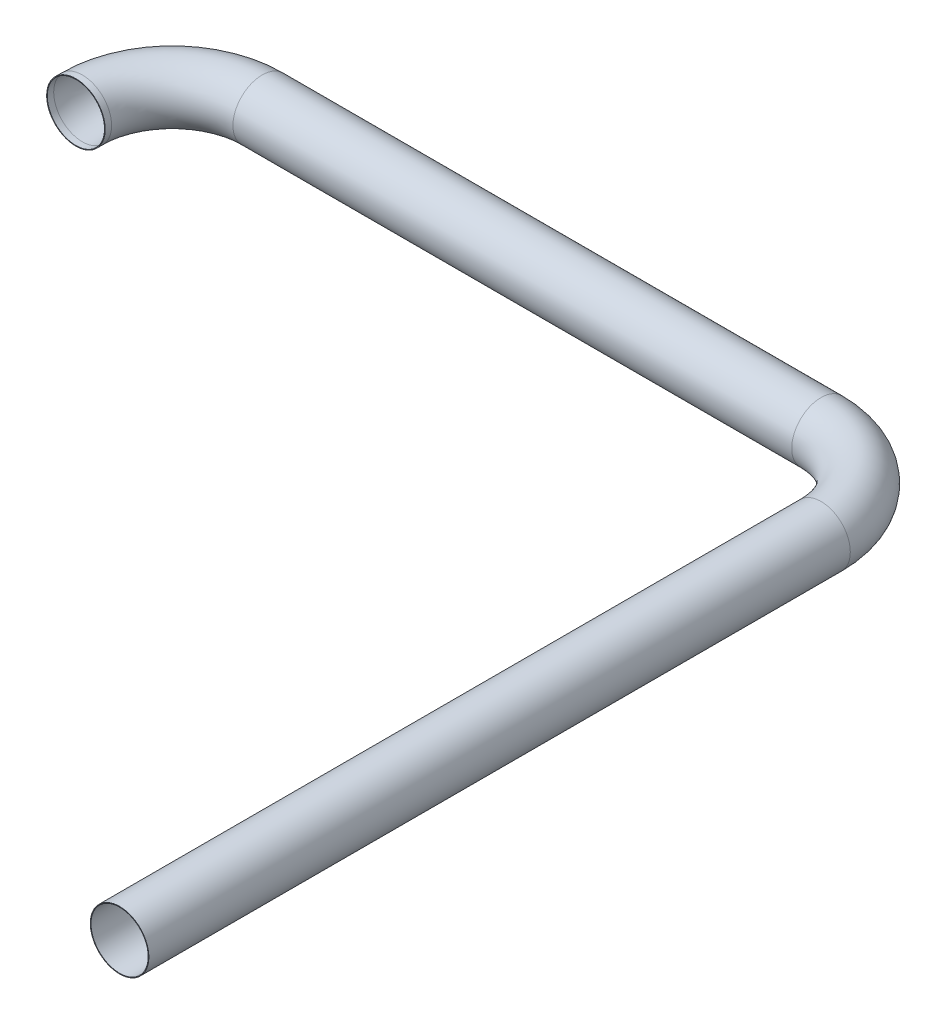
ISO-10303-21;
HEADER;
FILE_DESCRIPTION(('STEP AP214'),'2;1');
FILE_NAME('part.step','',(''),(''),'','','');
FILE_SCHEMA(('AUTOMOTIVE_DESIGN { 1 0 10303 214 1 1 1 1 }'));
ENDSEC;
DATA;
#1=APPLICATION_CONTEXT('core data for automotive mechanical design processes');
#2=APPLICATION_PROTOCOL_DEFINITION('international standard','automotive_design',2000,#1);
#3=PRODUCT_CONTEXT('',#1,'mechanical');
#4=PRODUCT('Part','Part','',(#3));
#5=PRODUCT_RELATED_PRODUCT_CATEGORY('part','',(#4));
#6=PRODUCT_DEFINITION_FORMATION('','',#4);
#7=PRODUCT_DEFINITION_CONTEXT('part definition',#1,'design');
#8=PRODUCT_DEFINITION('design','',#6,#7);
#9=PRODUCT_DEFINITION_SHAPE('','',#8);
#10=(LENGTH_UNIT() NAMED_UNIT(*) SI_UNIT(.MILLI.,.METRE.));
#11=(NAMED_UNIT(*) PLANE_ANGLE_UNIT() SI_UNIT($,.RADIAN.));
#12=(NAMED_UNIT(*) SI_UNIT($,.STERADIAN.) SOLID_ANGLE_UNIT());
#13=UNCERTAINTY_MEASURE_WITH_UNIT(LENGTH_MEASURE(1.E-05),#10,'distance_accuracy_value','');
#14=(GEOMETRIC_REPRESENTATION_CONTEXT(3) GLOBAL_UNCERTAINTY_ASSIGNED_CONTEXT((#13)) GLOBAL_UNIT_ASSIGNED_CONTEXT((#10,
#11,#12)) REPRESENTATION_CONTEXT('',''));
#15=CARTESIAN_POINT('',(0.,0.,0.));
#16=DIRECTION('',(0.,0.,1.));
#17=DIRECTION('',(1.,0.,0.));
#18=AXIS2_PLACEMENT_3D('',#15,#16,#17);
#19=CARTESIAN_POINT('',(0.,0.,0.));
#20=DIRECTION('',(0.,0.,-1.));
#21=DIRECTION('',(-1.,0.,0.));
#22=AXIS2_PLACEMENT_3D('',#19,#20,#21);
#23=CYLINDRICAL_SURFACE('',#22,45.59);
#24=CARTESIAN_POINT('',(0.,0.,-1092.));
#25=DIRECTION('',(0.,0.,1.));
#26=DIRECTION('',(1.,0.,0.));
#27=AXIS2_PLACEMENT_3D('',#24,#25,#26);
#28=CIRCLE('',#27,45.59);
#29=CARTESIAN_POINT('',(45.59,0.,-1092.));
#30=VERTEX_POINT('',#29);
#31=EDGE_CURVE('E124',#30,#30,#28,.T.);
#32=ORIENTED_EDGE('',*,*,#31,.T.);
#33=EDGE_LOOP('',(#32));
#34=FACE_BOUND('',#33,.T.);
#35=CARTESIAN_POINT('',(0.,0.,0.));
#36=DIRECTION('',(0.,0.,1.));
#37=DIRECTION('',(1.,0.,0.));
#38=AXIS2_PLACEMENT_3D('',#35,#36,#37);
#39=CIRCLE('',#38,45.59);
#40=CARTESIAN_POINT('',(45.59,0.,0.));
#41=VERTEX_POINT('',#40);
#42=EDGE_CURVE('E58',#41,#41,#39,.T.);
#43=ORIENTED_EDGE('',*,*,#42,.F.);
#44=EDGE_LOOP('',(#43));
#45=FACE_BOUND('',#44,.T.);
#46=ADVANCED_FACE('F43',(#34,#45),#23,.T.);
#47=CARTESIAN_POINT('',(-140.,0.,-1092.));
#48=DIRECTION('',(0.,1.,0.));
#49=DIRECTION('',(0.,0.,1.));
#50=AXIS2_PLACEMENT_3D('',#47,#48,#49);
#51=TOROIDAL_SURFACE('',#50,140.,45.59);
#52=CARTESIAN_POINT('',(-140.000000000001,0.,-1232.));
#53=DIRECTION('',(1.,0.,0.));
#54=DIRECTION('',(0.,0.,-1.));
#55=AXIS2_PLACEMENT_3D('',#52,#53,#54);
#56=CIRCLE('',#55,45.59);
#57=CARTESIAN_POINT('',(-140.000000000001,0.,-1277.59));
#58=VERTEX_POINT('',#57);
#59=EDGE_CURVE('E127',#58,#58,#56,.T.);
#60=CARTESIAN_POINT('',(-140.,0.,-1092.));
#61=DIRECTION('',(0.,1.,0.));
#62=DIRECTION('',(0.,0.,1.));
#63=AXIS2_PLACEMENT_3D('',#60,#61,#62);
#64=CIRCLE('',#63,185.59);
#65=EDGE_CURVE('',#30,#58,#64,.T.);
#66=ORIENTED_EDGE('',*,*,#31,.F.);
#67=ORIENTED_EDGE('',*,*,#59,.T.);
#68=ORIENTED_EDGE('',*,*,#65,.T.);
#69=ORIENTED_EDGE('',*,*,#65,.F.);
#70=EDGE_LOOP('',(#66,#68,#67,#69));
#71=FACE_BOUND('',#70,.T.);
#72=ADVANCED_FACE('F148',(#71),#51,.T.);
#73=CARTESIAN_POINT('',(-140.000000000001,0.,-1232.));
#74=DIRECTION('',(-1.,0.,0.));
#75=DIRECTION('',(0.,0.,1.));
#76=AXIS2_PLACEMENT_3D('',#73,#74,#75);
#77=CYLINDRICAL_SURFACE('',#76,45.59);
#78=CARTESIAN_POINT('',(-1010.,0.,-1232.));
#79=DIRECTION('',(1.,0.,0.));
#80=DIRECTION('',(0.,0.,-1.));
#81=AXIS2_PLACEMENT_3D('',#78,#79,#80);
#82=CIRCLE('',#81,45.59);
#83=CARTESIAN_POINT('',(-1010.,0.,-1277.59));
#84=VERTEX_POINT('',#83);
#85=EDGE_CURVE('E129',#84,#84,#82,.T.);
#86=ORIENTED_EDGE('',*,*,#85,.T.);
#87=EDGE_LOOP('',(#86));
#88=FACE_BOUND('',#87,.T.);
#89=ORIENTED_EDGE('',*,*,#59,.F.);
#90=EDGE_LOOP('',(#89));
#91=FACE_BOUND('',#90,.T.);
#92=ADVANCED_FACE('F144',(#88,#91),#77,.T.);
#93=CARTESIAN_POINT('',(-1010.,0.,-1092.));
#94=DIRECTION('',(0.,1.,0.));
#95=DIRECTION('',(0.,0.,1.));
#96=AXIS2_PLACEMENT_3D('',#93,#94,#95);
#97=TOROIDAL_SURFACE('',#96,140.,45.59);
#98=CARTESIAN_POINT('',(-1150.,0.,-1092.));
#99=DIRECTION('',(0.,0.,-1.));
#100=DIRECTION('',(-1.,0.,0.));
#101=AXIS2_PLACEMENT_3D('',#98,#99,#100);
#102=CIRCLE('',#101,45.59);
#103=CARTESIAN_POINT('',(-1195.59,0.,-1092.));
#104=VERTEX_POINT('',#103);
#105=EDGE_CURVE('E47',#104,#104,#102,.T.);
#106=CARTESIAN_POINT('',(-1010.,0.,-1092.));
#107=DIRECTION('',(0.,1.,0.));
#108=DIRECTION('',(0.,0.,1.));
#109=AXIS2_PLACEMENT_3D('',#106,#107,#108);
#110=CIRCLE('',#109,185.59);
#111=EDGE_CURVE('',#84,#104,#110,.T.);
#112=ORIENTED_EDGE('',*,*,#85,.F.);
#113=ORIENTED_EDGE('',*,*,#105,.T.);
#114=ORIENTED_EDGE('',*,*,#111,.T.);
#115=ORIENTED_EDGE('',*,*,#111,.F.);
#116=EDGE_LOOP('',(#112,#114,#113,#115));
#117=FACE_BOUND('',#116,.T.);
#118=ADVANCED_FACE('F136',(#117),#97,.T.);
#119=CARTESIAN_POINT('',(-1150.,0.,-1092.));
#120=DIRECTION('',(0.,0.,1.));
#121=DIRECTION('',(1.,0.,0.));
#122=AXIS2_PLACEMENT_3D('',#119,#120,#121);
#123=CYLINDRICAL_SURFACE('',#122,45.59);
#124=CARTESIAN_POINT('',(-1150.,0.,-1082.));
#125=DIRECTION('',(0.,0.,-1.));
#126=DIRECTION('',(-1.,0.,0.));
#127=AXIS2_PLACEMENT_3D('',#124,#125,#126);
#128=CIRCLE('',#127,45.59);
#129=CARTESIAN_POINT('',(-1195.59,0.,-1082.));
#130=VERTEX_POINT('',#129);
#131=EDGE_CURVE('E63',#130,#130,#128,.T.);
#132=ORIENTED_EDGE('',*,*,#131,.T.);
#133=EDGE_LOOP('',(#132));
#134=FACE_BOUND('',#133,.T.);
#135=ORIENTED_EDGE('',*,*,#105,.F.);
#136=EDGE_LOOP('',(#135));
#137=FACE_BOUND('',#136,.T.);
#138=ADVANCED_FACE('F45',(#134,#137),#123,.T.);
#139=CARTESIAN_POINT('',(0.,0.,0.));
#140=DIRECTION('',(0.,0.,1.));
#141=DIRECTION('',(1.,0.,0.));
#142=AXIS2_PLACEMENT_3D('',#139,#140,#141);
#143=PLANE('',#142);
#144=CARTESIAN_POINT('',(0.,0.,0.));
#145=DIRECTION('',(0.,0.,1.));
#146=DIRECTION('',(1.,0.,0.));
#147=AXIS2_PLACEMENT_3D('',#144,#145,#146);
#148=CIRCLE('',#147,44.59);
#149=CARTESIAN_POINT('',(44.59,0.,0.));
#150=VERTEX_POINT('',#149);
#151=EDGE_CURVE('E111',#150,#150,#148,.F.);
#152=ORIENTED_EDGE('',*,*,#151,.T.);
#153=EDGE_LOOP('',(#152));
#154=FACE_BOUND('',#153,.T.);
#155=ORIENTED_EDGE('',*,*,#42,.T.);
#156=EDGE_LOOP('',(#155));
#157=FACE_BOUND('',#156,.T.);
#158=ADVANCED_FACE('F76',(#154,#157),#143,.T.);
#159=CARTESIAN_POINT('',(-1150.,0.,-1082.));
#160=DIRECTION('',(0.,0.,-1.));
#161=DIRECTION('',(-1.,0.,0.));
#162=AXIS2_PLACEMENT_3D('',#159,#160,#161);
#163=PLANE('',#162);
#164=CARTESIAN_POINT('',(-1150.,0.,-1082.));
#165=DIRECTION('',(0.,0.,-1.));
#166=DIRECTION('',(-1.,0.,0.));
#167=AXIS2_PLACEMENT_3D('',#164,#165,#166);
#168=CIRCLE('',#167,44.59);
#169=CARTESIAN_POINT('',(-1194.59,0.,-1082.));
#170=VERTEX_POINT('',#169);
#171=EDGE_CURVE('E13',#170,#170,#168,.F.);
#172=ORIENTED_EDGE('',*,*,#171,.F.);
#173=EDGE_LOOP('',(#172));
#174=FACE_BOUND('',#173,.T.);
#175=ORIENTED_EDGE('',*,*,#131,.F.);
#176=EDGE_LOOP('',(#175));
#177=FACE_BOUND('',#176,.T.);
#178=ADVANCED_FACE('F73',(#174,#177),#163,.F.);
#179=CARTESIAN_POINT('',(0.,0.,0.));
#180=DIRECTION('',(0.,0.,-1.));
#181=DIRECTION('',(-1.,0.,0.));
#182=AXIS2_PLACEMENT_3D('',#179,#180,#181);
#183=CYLINDRICAL_SURFACE('',#182,44.59);
#184=CARTESIAN_POINT('',(0.,0.,-1092.));
#185=DIRECTION('',(0.,0.,1.));
#186=DIRECTION('',(1.,0.,0.));
#187=AXIS2_PLACEMENT_3D('',#184,#185,#186);
#188=CIRCLE('',#187,44.59);
#189=CARTESIAN_POINT('',(44.59,0.,-1092.));
#190=VERTEX_POINT('',#189);
#191=EDGE_CURVE('E110',#190,#190,#188,.F.);
#192=ORIENTED_EDGE('',*,*,#191,.T.);
#193=EDGE_LOOP('',(#192));
#194=FACE_BOUND('',#193,.T.);
#195=ORIENTED_EDGE('',*,*,#151,.F.);
#196=EDGE_LOOP('',(#195));
#197=FACE_BOUND('',#196,.T.);
#198=ADVANCED_FACE('F75',(#194,#197),#183,.F.);
#199=CARTESIAN_POINT('',(-140.,0.,-1092.));
#200=DIRECTION('',(0.,1.,0.));
#201=DIRECTION('',(0.,0.,1.));
#202=AXIS2_PLACEMENT_3D('',#199,#200,#201);
#203=TOROIDAL_SURFACE('',#202,140.,44.59);
#204=CARTESIAN_POINT('',(-140.000000000001,0.,-1232.));
#205=DIRECTION('',(1.,0.,0.));
#206=DIRECTION('',(0.,0.,-1.));
#207=AXIS2_PLACEMENT_3D('',#204,#205,#206);
#208=CIRCLE('',#207,44.59);
#209=CARTESIAN_POINT('',(-140.000000000001,0.,-1276.59));
#210=VERTEX_POINT('',#209);
#211=EDGE_CURVE('E107',#210,#210,#208,.F.);
#212=CARTESIAN_POINT('',(-140.,0.,-1092.));
#213=DIRECTION('',(0.,1.,0.));
#214=DIRECTION('',(0.,0.,1.));
#215=AXIS2_PLACEMENT_3D('',#212,#213,#214);
#216=CIRCLE('',#215,184.59);
#217=EDGE_CURVE('',#190,#210,#216,.T.);
#218=ORIENTED_EDGE('',*,*,#191,.F.);
#219=ORIENTED_EDGE('',*,*,#211,.T.);
#220=ORIENTED_EDGE('',*,*,#217,.T.);
#221=ORIENTED_EDGE('',*,*,#217,.F.);
#222=EDGE_LOOP('',(#218,#220,#219,#221));
#223=FACE_BOUND('',#222,.T.);
#224=ADVANCED_FACE('F82',(#223),#203,.F.);
#225=CARTESIAN_POINT('',(-140.000000000001,0.,-1232.));
#226=DIRECTION('',(-1.,0.,0.));
#227=DIRECTION('',(0.,0.,1.));
#228=AXIS2_PLACEMENT_3D('',#225,#226,#227);
#229=CYLINDRICAL_SURFACE('',#228,44.59);
#230=CARTESIAN_POINT('',(-1010.,0.,-1232.));
#231=DIRECTION('',(1.,0.,0.));
#232=DIRECTION('',(0.,0.,-1.));
#233=AXIS2_PLACEMENT_3D('',#230,#231,#232);
#234=CIRCLE('',#233,44.59);
#235=CARTESIAN_POINT('',(-1010.,0.,-1276.59));
#236=VERTEX_POINT('',#235);
#237=EDGE_CURVE('E113',#236,#236,#234,.F.);
#238=ORIENTED_EDGE('',*,*,#237,.T.);
#239=EDGE_LOOP('',(#238));
#240=FACE_BOUND('',#239,.T.);
#241=ORIENTED_EDGE('',*,*,#211,.F.);
#242=EDGE_LOOP('',(#241));
#243=FACE_BOUND('',#242,.T.);
#244=ADVANCED_FACE('F93',(#240,#243),#229,.F.);
#245=CARTESIAN_POINT('',(-1010.,0.,-1092.));
#246=DIRECTION('',(0.,1.,0.));
#247=DIRECTION('',(0.,0.,1.));
#248=AXIS2_PLACEMENT_3D('',#245,#246,#247);
#249=TOROIDAL_SURFACE('',#248,140.,44.59);
#250=CARTESIAN_POINT('',(-1150.,0.,-1092.));
#251=DIRECTION('',(0.,0.,-1.));
#252=DIRECTION('',(-1.,0.,0.));
#253=AXIS2_PLACEMENT_3D('',#250,#251,#252);
#254=CIRCLE('',#253,44.59);
#255=CARTESIAN_POINT('',(-1194.59,0.,-1092.));
#256=VERTEX_POINT('',#255);
#257=EDGE_CURVE('E52',#256,#256,#254,.F.);
#258=CARTESIAN_POINT('',(-1010.,0.,-1092.));
#259=DIRECTION('',(0.,1.,0.));
#260=DIRECTION('',(0.,0.,1.));
#261=AXIS2_PLACEMENT_3D('',#258,#259,#260);
#262=CIRCLE('',#261,184.59);
#263=EDGE_CURVE('',#236,#256,#262,.T.);
#264=ORIENTED_EDGE('',*,*,#237,.F.);
#265=ORIENTED_EDGE('',*,*,#257,.T.);
#266=ORIENTED_EDGE('',*,*,#263,.T.);
#267=ORIENTED_EDGE('',*,*,#263,.F.);
#268=EDGE_LOOP('',(#264,#266,#265,#267));
#269=FACE_BOUND('',#268,.T.);
#270=ADVANCED_FACE('F89',(#269),#249,.F.);
#271=CARTESIAN_POINT('',(-1150.,0.,-1092.));
#272=DIRECTION('',(0.,0.,1.));
#273=DIRECTION('',(1.,0.,0.));
#274=AXIS2_PLACEMENT_3D('',#271,#272,#273);
#275=CYLINDRICAL_SURFACE('',#274,44.59);
#276=ORIENTED_EDGE('',*,*,#171,.T.);
#277=EDGE_LOOP('',(#276));
#278=FACE_BOUND('',#277,.T.);
#279=ORIENTED_EDGE('',*,*,#257,.F.);
#280=EDGE_LOOP('',(#279));
#281=FACE_BOUND('',#280,.T.);
#282=ADVANCED_FACE('F70',(#278,#281),#275,.F.);
#283=CLOSED_SHELL('',(#46,#72,#92,#118,#138,#158,#178,#198,#224,#244,#270,#282));
#284=MANIFOLD_SOLID_BREP('B2',#283);
#285=ADVANCED_BREP_SHAPE_REPRESENTATION('',(#18,#284),#14);
#286=SHAPE_DEFINITION_REPRESENTATION(#9,#285);
ENDSEC;
END-ISO-10303-21;
